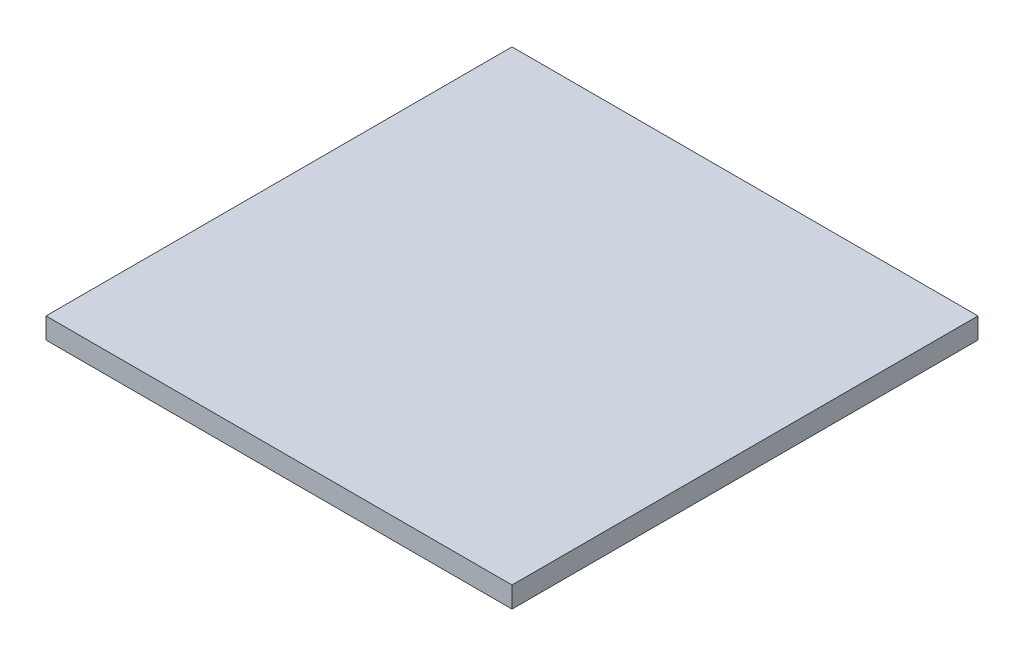
ISO-10303-21;
HEADER;
FILE_DESCRIPTION(('STEP AP214'),'2;1');
FILE_NAME('part.step','',(''),(''),'','','');
FILE_SCHEMA(('AUTOMOTIVE_DESIGN { 1 0 10303 214 1 1 1 1 }'));
ENDSEC;
DATA;
#1=APPLICATION_CONTEXT('core data for automotive mechanical design processes');
#2=APPLICATION_PROTOCOL_DEFINITION('international standard','automotive_design',2000,#1);
#3=PRODUCT_CONTEXT('',#1,'mechanical');
#4=PRODUCT('Part','Part','',(#3));
#5=PRODUCT_RELATED_PRODUCT_CATEGORY('part','',(#4));
#6=PRODUCT_DEFINITION_FORMATION('','',#4);
#7=PRODUCT_DEFINITION_CONTEXT('part definition',#1,'design');
#8=PRODUCT_DEFINITION('design','',#6,#7);
#9=PRODUCT_DEFINITION_SHAPE('','',#8);
#10=(LENGTH_UNIT() NAMED_UNIT(*) SI_UNIT(.MILLI.,.METRE.));
#11=(NAMED_UNIT(*) PLANE_ANGLE_UNIT() SI_UNIT($,.RADIAN.));
#12=(NAMED_UNIT(*) SI_UNIT($,.STERADIAN.) SOLID_ANGLE_UNIT());
#13=UNCERTAINTY_MEASURE_WITH_UNIT(LENGTH_MEASURE(1.E-05),#10,'distance_accuracy_value','');
#14=(GEOMETRIC_REPRESENTATION_CONTEXT(3) GLOBAL_UNCERTAINTY_ASSIGNED_CONTEXT((#13)) GLOBAL_UNIT_ASSIGNED_CONTEXT((#10,
#11,#12)) REPRESENTATION_CONTEXT('',''));
#15=CARTESIAN_POINT('',(0.,0.,0.));
#16=DIRECTION('',(0.,0.,1.));
#17=DIRECTION('',(1.,0.,0.));
#18=AXIS2_PLACEMENT_3D('',#15,#16,#17);
#19=CARTESIAN_POINT('',(24.5,1.1,24.5));
#20=DIRECTION('',(-1.,0.,0.));
#21=DIRECTION('',(0.,0.,1.));
#22=AXIS2_PLACEMENT_3D('',#19,#20,#21);
#23=PLANE('',#22);
#24=DIRECTION('',(0.,0.,-1.));
#25=VECTOR('',#24,1.);
#26=CARTESIAN_POINT('',(24.5,-1.1,24.5));
#27=LINE('',#26,#25);
#28=CARTESIAN_POINT('',(24.5,-1.1,24.5));
#29=VERTEX_POINT('',#28);
#30=CARTESIAN_POINT('',(24.5,-1.1,-24.5));
#31=VERTEX_POINT('',#30);
#32=EDGE_CURVE('E107',#29,#31,#27,.T.);
#33=ORIENTED_EDGE('',*,*,#32,.T.);
#34=DIRECTION('',(0.,-1.,0.));
#35=VECTOR('',#34,1.);
#36=CARTESIAN_POINT('',(24.5,1.1,-24.5));
#37=LINE('',#36,#35);
#38=CARTESIAN_POINT('',(24.5,1.1,-24.5));
#39=VERTEX_POINT('',#38);
#40=EDGE_CURVE('E11',#39,#31,#37,.T.);
#41=ORIENTED_EDGE('',*,*,#40,.F.);
#42=DIRECTION('',(0.,0.,-1.));
#43=VECTOR('',#42,1.);
#44=CARTESIAN_POINT('',(24.5,1.1,24.5));
#45=LINE('',#44,#43);
#46=CARTESIAN_POINT('',(24.5,1.1,24.5));
#47=VERTEX_POINT('',#46);
#48=EDGE_CURVE('E91',#47,#39,#45,.T.);
#49=ORIENTED_EDGE('',*,*,#48,.F.);
#50=DIRECTION('',(0.,-1.,0.));
#51=VECTOR('',#50,1.);
#52=CARTESIAN_POINT('',(24.5,1.1,24.5));
#53=LINE('',#52,#51);
#54=EDGE_CURVE('E103',#47,#29,#53,.T.);
#55=ORIENTED_EDGE('',*,*,#54,.T.);
#56=EDGE_LOOP('',(#33,#41,#49,#55));
#57=FACE_BOUND('',#56,.T.);
#58=ADVANCED_FACE('F39',(#57),#23,.F.);
#59=CARTESIAN_POINT('',(-24.5,1.1,-24.5));
#60=DIRECTION('',(0.,0.,1.));
#61=DIRECTION('',(1.,0.,0.));
#62=AXIS2_PLACEMENT_3D('',#59,#60,#61);
#63=PLANE('',#62);
#64=DIRECTION('',(-1.,0.,0.));
#65=VECTOR('',#64,1.);
#66=CARTESIAN_POINT('',(-24.5,-1.1,-24.5));
#67=LINE('',#66,#65);
#68=CARTESIAN_POINT('',(-24.5,-1.1,-24.5));
#69=VERTEX_POINT('',#68);
#70=EDGE_CURVE('E96',#31,#69,#67,.T.);
#71=ORIENTED_EDGE('',*,*,#70,.T.);
#72=DIRECTION('',(0.,-1.,0.));
#73=VECTOR('',#72,1.);
#74=CARTESIAN_POINT('',(-24.5,1.1,-24.5));
#75=LINE('',#74,#73);
#76=CARTESIAN_POINT('',(-24.5,1.1,-24.5));
#77=VERTEX_POINT('',#76);
#78=EDGE_CURVE('E48',#77,#69,#75,.T.);
#79=ORIENTED_EDGE('',*,*,#78,.F.);
#80=DIRECTION('',(-1.,0.,0.));
#81=VECTOR('',#80,1.);
#82=CARTESIAN_POINT('',(-24.5,1.1,-24.5));
#83=LINE('',#82,#81);
#84=EDGE_CURVE('E86',#39,#77,#83,.T.);
#85=ORIENTED_EDGE('',*,*,#84,.F.);
#86=ORIENTED_EDGE('',*,*,#40,.T.);
#87=EDGE_LOOP('',(#71,#79,#85,#86));
#88=FACE_BOUND('',#87,.T.);
#89=ADVANCED_FACE('F95',(#88),#63,.F.);
#90=CARTESIAN_POINT('',(-24.5,1.1,24.5));
#91=DIRECTION('',(1.,0.,0.));
#92=DIRECTION('',(0.,0.,-1.));
#93=AXIS2_PLACEMENT_3D('',#90,#91,#92);
#94=PLANE('',#93);
#95=DIRECTION('',(0.,0.,1.));
#96=VECTOR('',#95,1.);
#97=CARTESIAN_POINT('',(-24.5,-1.1,24.5));
#98=LINE('',#97,#96);
#99=CARTESIAN_POINT('',(-24.5,-1.1,24.5));
#100=VERTEX_POINT('',#99);
#101=EDGE_CURVE('E73',#69,#100,#98,.T.);
#102=ORIENTED_EDGE('',*,*,#101,.T.);
#103=DIRECTION('',(0.,-1.,0.));
#104=VECTOR('',#103,1.);
#105=CARTESIAN_POINT('',(-24.5,1.1,24.5));
#106=LINE('',#105,#104);
#107=CARTESIAN_POINT('',(-24.5,1.1,24.5));
#108=VERTEX_POINT('',#107);
#109=EDGE_CURVE('E98',#108,#100,#106,.T.);
#110=ORIENTED_EDGE('',*,*,#109,.F.);
#111=DIRECTION('',(0.,0.,1.));
#112=VECTOR('',#111,1.);
#113=CARTESIAN_POINT('',(-24.5,1.1,24.5));
#114=LINE('',#113,#112);
#115=EDGE_CURVE('E89',#77,#108,#114,.T.);
#116=ORIENTED_EDGE('',*,*,#115,.F.);
#117=ORIENTED_EDGE('',*,*,#78,.T.);
#118=EDGE_LOOP('',(#102,#110,#116,#117));
#119=FACE_BOUND('',#118,.T.);
#120=ADVANCED_FACE('F99',(#119),#94,.F.);
#121=CARTESIAN_POINT('',(-24.5,1.1,24.5));
#122=DIRECTION('',(0.,0.,-1.));
#123=DIRECTION('',(-1.,0.,0.));
#124=AXIS2_PLACEMENT_3D('',#121,#122,#123);
#125=PLANE('',#124);
#126=DIRECTION('',(1.,0.,0.));
#127=VECTOR('',#126,1.);
#128=CARTESIAN_POINT('',(-24.5,-1.1,24.5));
#129=LINE('',#128,#127);
#130=EDGE_CURVE('E79',#100,#29,#129,.T.);
#131=ORIENTED_EDGE('',*,*,#130,.T.);
#132=ORIENTED_EDGE('',*,*,#54,.F.);
#133=DIRECTION('',(1.,0.,0.));
#134=VECTOR('',#133,1.);
#135=CARTESIAN_POINT('',(-24.5,1.1,24.5));
#136=LINE('',#135,#134);
#137=EDGE_CURVE('E56',#108,#47,#136,.T.);
#138=ORIENTED_EDGE('',*,*,#137,.F.);
#139=ORIENTED_EDGE('',*,*,#109,.T.);
#140=EDGE_LOOP('',(#131,#132,#138,#139));
#141=FACE_BOUND('',#140,.T.);
#142=ADVANCED_FACE('F120',(#141),#125,.F.);
#143=CARTESIAN_POINT('',(0.,1.1,0.));
#144=DIRECTION('',(0.,-1.,0.));
#145=DIRECTION('',(0.,0.,-1.));
#146=AXIS2_PLACEMENT_3D('',#143,#144,#145);
#147=PLANE('',#146);
#148=ORIENTED_EDGE('',*,*,#48,.T.);
#149=ORIENTED_EDGE('',*,*,#84,.T.);
#150=ORIENTED_EDGE('',*,*,#115,.T.);
#151=ORIENTED_EDGE('',*,*,#137,.T.);
#152=EDGE_LOOP('',(#148,#149,#150,#151));
#153=FACE_BOUND('',#152,.T.);
#154=ADVANCED_FACE('F87',(#153),#147,.F.);
#155=CARTESIAN_POINT('',(0.,-1.1,0.));
#156=DIRECTION('',(0.,-1.,0.));
#157=DIRECTION('',(0.,0.,-1.));
#158=AXIS2_PLACEMENT_3D('',#155,#156,#157);
#159=PLANE('',#158);
#160=ORIENTED_EDGE('',*,*,#32,.F.);
#161=ORIENTED_EDGE('',*,*,#130,.F.);
#162=ORIENTED_EDGE('',*,*,#101,.F.);
#163=ORIENTED_EDGE('',*,*,#70,.F.);
#164=EDGE_LOOP('',(#160,#161,#162,#163));
#165=FACE_BOUND('',#164,.T.);
#166=ADVANCED_FACE('F123',(#165),#159,.T.);
#167=CLOSED_SHELL('',(#58,#89,#120,#142,#154,#166));
#168=MANIFOLD_SOLID_BREP('B2',#167);
#169=ADVANCED_BREP_SHAPE_REPRESENTATION('',(#18,#168),#14);
#170=SHAPE_DEFINITION_REPRESENTATION(#9,#169);
ENDSEC;
END-ISO-10303-21;
